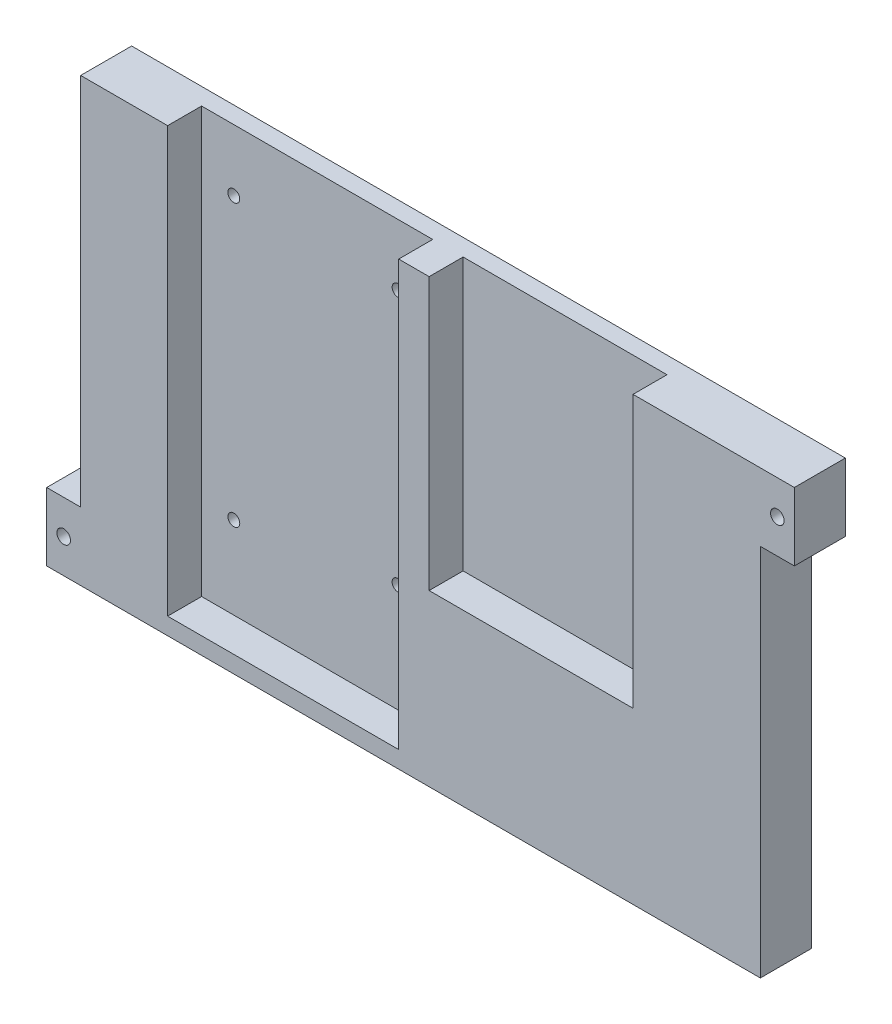
ISO-10303-21;
HEADER;
FILE_DESCRIPTION(('STEP AP214'),'2;1');
FILE_NAME('part.step','',(''),(''),'','','');
FILE_SCHEMA(('AUTOMOTIVE_DESIGN { 1 0 10303 214 1 1 1 1 }'));
ENDSEC;
DATA;
#1=APPLICATION_CONTEXT('core data for automotive mechanical design processes');
#2=APPLICATION_PROTOCOL_DEFINITION('international standard','automotive_design',2000,#1);
#3=PRODUCT_CONTEXT('',#1,'mechanical');
#4=PRODUCT('Part','Part','',(#3));
#5=PRODUCT_RELATED_PRODUCT_CATEGORY('part','',(#4));
#6=PRODUCT_DEFINITION_FORMATION('','',#4);
#7=PRODUCT_DEFINITION_CONTEXT('part definition',#1,'design');
#8=PRODUCT_DEFINITION('design','',#6,#7);
#9=PRODUCT_DEFINITION_SHAPE('','',#8);
#10=(LENGTH_UNIT() NAMED_UNIT(*) SI_UNIT(.MILLI.,.METRE.));
#11=(NAMED_UNIT(*) PLANE_ANGLE_UNIT() SI_UNIT($,.RADIAN.));
#12=(NAMED_UNIT(*) SI_UNIT($,.STERADIAN.) SOLID_ANGLE_UNIT());
#13=UNCERTAINTY_MEASURE_WITH_UNIT(LENGTH_MEASURE(1.E-05),#10,'distance_accuracy_value','');
#14=(GEOMETRIC_REPRESENTATION_CONTEXT(3) GLOBAL_UNCERTAINTY_ASSIGNED_CONTEXT((#13)) GLOBAL_UNIT_ASSIGNED_CONTEXT((#10,
#11,#12)) REPRESENTATION_CONTEXT('',''));
#15=CARTESIAN_POINT('',(0.,0.,0.));
#16=DIRECTION('',(0.,0.,1.));
#17=DIRECTION('',(1.,0.,0.));
#18=AXIS2_PLACEMENT_3D('',#15,#16,#17);
#19=CARTESIAN_POINT('',(0.,130.,15.));
#20=DIRECTION('',(0.,1.,0.));
#21=DIRECTION('',(-1.,0.,0.));
#22=AXIS2_PLACEMENT_3D('',#19,#20,#21);
#23=PLANE('',#22);
#24=DIRECTION('',(0.,0.,1.));
#25=VECTOR('',#24,1.);
#26=CARTESIAN_POINT('',(25.5840381624613,130.,5.));
#27=LINE('',#26,#25);
#28=CARTESIAN_POINT('',(25.5840381624613,130.,5.));
#29=VERTEX_POINT('',#28);
#30=CARTESIAN_POINT('',(25.5840381624613,130.,15.));
#31=VERTEX_POINT('',#30);
#32=EDGE_CURVE('E214',#29,#31,#27,.T.);
#33=ORIENTED_EDGE('',*,*,#32,.F.);
#34=DIRECTION('',(-1.,0.,0.));
#35=VECTOR('',#34,1.);
#36=CARTESIAN_POINT('',(25.5840381624613,130.,5.));
#37=LINE('',#36,#35);
#38=CARTESIAN_POINT('',(93.5840381624613,130.,5.));
#39=VERTEX_POINT('',#38);
#40=EDGE_CURVE('E253',#39,#29,#37,.T.);
#41=ORIENTED_EDGE('',*,*,#40,.F.);
#42=DIRECTION('',(0.,0.,1.));
#43=VECTOR('',#42,1.);
#44=CARTESIAN_POINT('',(93.5840381624613,130.,5.));
#45=LINE('',#44,#43);
#46=CARTESIAN_POINT('',(93.5840381624613,130.,15.));
#47=VERTEX_POINT('',#46);
#48=EDGE_CURVE('E314',#39,#47,#45,.T.);
#49=ORIENTED_EDGE('',*,*,#48,.T.);
#50=DIRECTION('',(1.,0.,0.));
#51=VECTOR('',#50,1.);
#52=CARTESIAN_POINT('',(0.,130.,15.));
#53=LINE('',#52,#51);
#54=CARTESIAN_POINT('',(102.534942581207,130.,15.));
#55=VERTEX_POINT('',#54);
#56=EDGE_CURVE('E273',#47,#55,#53,.T.);
#57=ORIENTED_EDGE('',*,*,#56,.T.);
#58=DIRECTION('',(0.,0.,1.));
#59=VECTOR('',#58,1.);
#60=CARTESIAN_POINT('',(102.534942581207,130.,5.));
#61=LINE('',#60,#59);
#62=CARTESIAN_POINT('',(102.534942581207,130.,5.));
#63=VERTEX_POINT('',#62);
#64=EDGE_CURVE('E291',#63,#55,#61,.T.);
#65=ORIENTED_EDGE('',*,*,#64,.F.);
#66=DIRECTION('',(-1.,0.,0.));
#67=VECTOR('',#66,1.);
#68=CARTESIAN_POINT('',(102.534942581207,130.,5.));
#69=LINE('',#68,#67);
#70=CARTESIAN_POINT('',(162.534942581207,130.,5.));
#71=VERTEX_POINT('',#70);
#72=EDGE_CURVE('E301',#71,#63,#69,.T.);
#73=ORIENTED_EDGE('',*,*,#72,.F.);
#74=DIRECTION('',(0.,0.,1.));
#75=VECTOR('',#74,1.);
#76=CARTESIAN_POINT('',(162.534942581207,130.,5.));
#77=LINE('',#76,#75);
#78=CARTESIAN_POINT('',(162.534942581207,130.,15.));
#79=VERTEX_POINT('',#78);
#80=EDGE_CURVE('E326',#71,#79,#77,.T.);
#81=ORIENTED_EDGE('',*,*,#80,.T.);
#82=CARTESIAN_POINT('',(210.,130.,15.));
#83=VERTEX_POINT('',#82);
#84=EDGE_CURVE('E217',#79,#83,#53,.T.);
#85=ORIENTED_EDGE('',*,*,#84,.T.);
#86=DIRECTION('',(0.,0.,1.));
#87=VECTOR('',#86,1.);
#88=CARTESIAN_POINT('',(210.,130.,15.));
#89=LINE('',#88,#87);
#90=CARTESIAN_POINT('',(210.,130.,0.));
#91=VERTEX_POINT('',#90);
#92=EDGE_CURVE('E408',#91,#83,#89,.T.);
#93=ORIENTED_EDGE('',*,*,#92,.F.);
#94=DIRECTION('',(1.,0.,0.));
#95=VECTOR('',#94,1.);
#96=CARTESIAN_POINT('',(0.,130.,0.));
#97=LINE('',#96,#95);
#98=CARTESIAN_POINT('',(0.,130.,0.));
#99=VERTEX_POINT('',#98);
#100=EDGE_CURVE('E212',#99,#91,#97,.T.);
#101=ORIENTED_EDGE('',*,*,#100,.F.);
#102=DIRECTION('',(0.,0.,-1.));
#103=VECTOR('',#102,1.);
#104=CARTESIAN_POINT('',(0.,130.,15.));
#105=LINE('',#104,#103);
#106=CARTESIAN_POINT('',(0.,130.,15.));
#107=VERTEX_POINT('',#106);
#108=EDGE_CURVE('E12',#107,#99,#105,.T.);
#109=ORIENTED_EDGE('',*,*,#108,.F.);
#110=EDGE_CURVE('E269',#107,#31,#53,.T.);
#111=ORIENTED_EDGE('',*,*,#110,.T.);
#112=EDGE_LOOP('',(#33,#41,#49,#57,#65,#73,#81,#85,#93,#101,#109,#111));
#113=FACE_BOUND('',#112,.T.);
#114=ADVANCED_FACE('F44',(#113),#23,.T.);
#115=CARTESIAN_POINT('',(0.,0.,15.));
#116=DIRECTION('',(-1.,0.,0.));
#117=DIRECTION('',(0.,-1.,0.));
#118=AXIS2_PLACEMENT_3D('',#115,#116,#117);
#119=PLANE('',#118);
#120=DIRECTION('',(0.,0.,-1.));
#121=VECTOR('',#120,1.);
#122=CARTESIAN_POINT('',(0.,20.,0.));
#123=LINE('',#122,#121);
#124=CARTESIAN_POINT('',(0.,20.,15.));
#125=VERTEX_POINT('',#124);
#126=CARTESIAN_POINT('',(0.,20.,0.));
#127=VERTEX_POINT('',#126);
#128=EDGE_CURVE('E60',#125,#127,#123,.T.);
#129=ORIENTED_EDGE('',*,*,#128,.F.);
#130=DIRECTION('',(0.,1.,0.));
#131=VECTOR('',#130,1.);
#132=CARTESIAN_POINT('',(0.,0.,15.));
#133=LINE('',#132,#131);
#134=EDGE_CURVE('E206',#125,#107,#133,.T.);
#135=ORIENTED_EDGE('',*,*,#134,.T.);
#136=ORIENTED_EDGE('',*,*,#108,.T.);
#137=DIRECTION('',(0.,1.,0.));
#138=VECTOR('',#137,1.);
#139=CARTESIAN_POINT('',(0.,0.,0.));
#140=LINE('',#139,#138);
#141=EDGE_CURVE('E169',#127,#99,#140,.T.);
#142=ORIENTED_EDGE('',*,*,#141,.F.);
#143=EDGE_LOOP('',(#129,#135,#136,#142));
#144=FACE_BOUND('',#143,.T.);
#145=ADVANCED_FACE('F375',(#144),#119,.T.);
#146=CARTESIAN_POINT('',(0.,0.,15.));
#147=DIRECTION('',(0.,1.,0.));
#148=DIRECTION('',(-1.,0.,0.));
#149=AXIS2_PLACEMENT_3D('',#146,#147,#148);
#150=PLANE('',#149);
#151=DIRECTION('',(1.,0.,0.));
#152=VECTOR('',#151,1.);
#153=CARTESIAN_POINT('',(0.,0.,0.));
#154=LINE('',#153,#152);
#155=CARTESIAN_POINT('',(-10.,0.,0.));
#156=VERTEX_POINT('',#155);
#157=CARTESIAN_POINT('',(200.,0.,0.));
#158=VERTEX_POINT('',#157);
#159=EDGE_CURVE('E158',#156,#158,#154,.T.);
#160=ORIENTED_EDGE('',*,*,#159,.T.);
#161=DIRECTION('',(0.,0.,-1.));
#162=VECTOR('',#161,1.);
#163=CARTESIAN_POINT('',(200.,0.,15.));
#164=LINE('',#163,#162);
#165=CARTESIAN_POINT('',(200.,0.,15.));
#166=VERTEX_POINT('',#165);
#167=EDGE_CURVE('E52',#166,#158,#164,.T.);
#168=ORIENTED_EDGE('',*,*,#167,.F.);
#169=DIRECTION('',(1.,0.,0.));
#170=VECTOR('',#169,1.);
#171=CARTESIAN_POINT('',(0.,0.,15.));
#172=LINE('',#171,#170);
#173=CARTESIAN_POINT('',(-10.,0.,15.));
#174=VERTEX_POINT('',#173);
#175=EDGE_CURVE('E175',#174,#166,#172,.T.);
#176=ORIENTED_EDGE('',*,*,#175,.F.);
#177=DIRECTION('',(0.,0.,1.));
#178=VECTOR('',#177,1.);
#179=CARTESIAN_POINT('',(-10.,0.,0.));
#180=LINE('',#179,#178);
#181=EDGE_CURVE('E172',#156,#174,#180,.T.);
#182=ORIENTED_EDGE('',*,*,#181,.F.);
#183=EDGE_LOOP('',(#160,#168,#176,#182));
#184=FACE_BOUND('',#183,.T.);
#185=ADVANCED_FACE('F173',(#184),#150,.F.);
#186=CARTESIAN_POINT('',(200.,0.,15.));
#187=DIRECTION('',(1.,0.,0.));
#188=DIRECTION('',(0.,1.,0.));
#189=AXIS2_PLACEMENT_3D('',#186,#187,#188);
#190=PLANE('',#189);
#191=DIRECTION('',(0.,0.,-1.));
#192=VECTOR('',#191,1.);
#193=CARTESIAN_POINT('',(200.,110.,15.));
#194=LINE('',#193,#192);
#195=CARTESIAN_POINT('',(200.,110.,15.));
#196=VERTEX_POINT('',#195);
#197=CARTESIAN_POINT('',(200.,110.,0.));
#198=VERTEX_POINT('',#197);
#199=EDGE_CURVE('E68',#196,#198,#194,.T.);
#200=ORIENTED_EDGE('',*,*,#199,.F.);
#201=DIRECTION('',(0.,-1.,0.));
#202=VECTOR('',#201,1.);
#203=CARTESIAN_POINT('',(200.,0.,15.));
#204=LINE('',#203,#202);
#205=EDGE_CURVE('E205',#196,#166,#204,.T.);
#206=ORIENTED_EDGE('',*,*,#205,.T.);
#207=ORIENTED_EDGE('',*,*,#167,.T.);
#208=DIRECTION('',(0.,-1.,0.));
#209=VECTOR('',#208,1.);
#210=CARTESIAN_POINT('',(200.,0.,0.));
#211=LINE('',#210,#209);
#212=EDGE_CURVE('E165',#198,#158,#211,.T.);
#213=ORIENTED_EDGE('',*,*,#212,.F.);
#214=EDGE_LOOP('',(#200,#206,#207,#213));
#215=FACE_BOUND('',#214,.T.);
#216=ADVANCED_FACE('F493',(#215),#190,.T.);
#217=CARTESIAN_POINT('',(0.,0.,15.));
#218=DIRECTION('',(0.,0.,1.));
#219=DIRECTION('',(1.,0.,0.));
#220=AXIS2_PLACEMENT_3D('',#217,#218,#219);
#221=PLANE('',#220);
#222=CARTESIAN_POINT('',(-5.,10.,15.));
#223=DIRECTION('',(0.,0.,1.));
#224=DIRECTION('',(1.,0.,0.));
#225=AXIS2_PLACEMENT_3D('',#222,#223,#224);
#226=CIRCLE('',#225,2.);
#227=CARTESIAN_POINT('',(-3.,10.,15.));
#228=VERTEX_POINT('',#227);
#229=EDGE_CURVE('E185',#228,#228,#226,.F.);
#230=ORIENTED_EDGE('',*,*,#229,.T.);
#231=EDGE_LOOP('',(#230));
#232=FACE_BOUND('',#231,.T.);
#233=CARTESIAN_POINT('',(205.,120.,15.));
#234=DIRECTION('',(0.,0.,1.));
#235=DIRECTION('',(1.,0.,0.));
#236=AXIS2_PLACEMENT_3D('',#233,#234,#235);
#237=CIRCLE('',#236,2.);
#238=CARTESIAN_POINT('',(207.,120.,15.));
#239=VERTEX_POINT('',#238);
#240=EDGE_CURVE('E348',#239,#239,#237,.F.);
#241=ORIENTED_EDGE('',*,*,#240,.T.);
#242=EDGE_LOOP('',(#241));
#243=FACE_BOUND('',#242,.T.);
#244=DIRECTION('',(0.,-1.,0.));
#245=VECTOR('',#244,1.);
#246=CARTESIAN_POINT('',(25.5840381624613,130.,15.));
#247=LINE('',#246,#245);
#248=CARTESIAN_POINT('',(25.5840381624613,5.,15.));
#249=VERTEX_POINT('',#248);
#250=EDGE_CURVE('E300',#31,#249,#247,.T.);
#251=ORIENTED_EDGE('',*,*,#250,.F.);
#252=ORIENTED_EDGE('',*,*,#110,.F.);
#253=ORIENTED_EDGE('',*,*,#134,.F.);
#254=DIRECTION('',(1.,0.,0.));
#255=VECTOR('',#254,1.);
#256=CARTESIAN_POINT('',(-10.,20.,15.));
#257=LINE('',#256,#255);
#258=CARTESIAN_POINT('',(-10.,20.,15.));
#259=VERTEX_POINT('',#258);
#260=EDGE_CURVE('E426',#259,#125,#257,.T.);
#261=ORIENTED_EDGE('',*,*,#260,.F.);
#262=DIRECTION('',(0.,1.,0.));
#263=VECTOR('',#262,1.);
#264=CARTESIAN_POINT('',(-10.,20.,15.));
#265=LINE('',#264,#263);
#266=EDGE_CURVE('E178',#174,#259,#265,.T.);
#267=ORIENTED_EDGE('',*,*,#266,.F.);
#268=ORIENTED_EDGE('',*,*,#175,.T.);
#269=ORIENTED_EDGE('',*,*,#205,.F.);
#270=DIRECTION('',(-1.,0.,0.));
#271=VECTOR('',#270,1.);
#272=CARTESIAN_POINT('',(210.,110.,15.));
#273=LINE('',#272,#271);
#274=CARTESIAN_POINT('',(210.,110.,15.));
#275=VERTEX_POINT('',#274);
#276=EDGE_CURVE('E422',#275,#196,#273,.T.);
#277=ORIENTED_EDGE('',*,*,#276,.F.);
#278=DIRECTION('',(0.,-1.,0.));
#279=VECTOR('',#278,1.);
#280=CARTESIAN_POINT('',(210.,130.,15.));
#281=LINE('',#280,#279);
#282=EDGE_CURVE('E415',#83,#275,#281,.T.);
#283=ORIENTED_EDGE('',*,*,#282,.F.);
#284=ORIENTED_EDGE('',*,*,#84,.F.);
#285=DIRECTION('',(0.,1.,0.));
#286=VECTOR('',#285,1.);
#287=CARTESIAN_POINT('',(162.534942581207,130.,15.));
#288=LINE('',#287,#286);
#289=CARTESIAN_POINT('',(162.534942581207,50.,15.));
#290=VERTEX_POINT('',#289);
#291=EDGE_CURVE('E265',#290,#79,#288,.T.);
#292=ORIENTED_EDGE('',*,*,#291,.F.);
#293=DIRECTION('',(1.,0.,0.));
#294=VECTOR('',#293,1.);
#295=CARTESIAN_POINT('',(102.534942581207,50.,15.));
#296=LINE('',#295,#294);
#297=CARTESIAN_POINT('',(102.534942581207,50.,15.));
#298=VERTEX_POINT('',#297);
#299=EDGE_CURVE('E290',#298,#290,#296,.T.);
#300=ORIENTED_EDGE('',*,*,#299,.F.);
#301=DIRECTION('',(0.,-1.,0.));
#302=VECTOR('',#301,1.);
#303=CARTESIAN_POINT('',(102.534942581207,130.,15.));
#304=LINE('',#303,#302);
#305=EDGE_CURVE('E297',#55,#298,#304,.T.);
#306=ORIENTED_EDGE('',*,*,#305,.F.);
#307=ORIENTED_EDGE('',*,*,#56,.F.);
#308=DIRECTION('',(0.,1.,0.));
#309=VECTOR('',#308,1.);
#310=CARTESIAN_POINT('',(93.5840381624613,130.,15.));
#311=LINE('',#310,#309);
#312=CARTESIAN_POINT('',(93.5840381624613,5.,15.));
#313=VERTEX_POINT('',#312);
#314=EDGE_CURVE('E242',#313,#47,#311,.T.);
#315=ORIENTED_EDGE('',*,*,#314,.F.);
#316=DIRECTION('',(1.,0.,0.));
#317=VECTOR('',#316,1.);
#318=CARTESIAN_POINT('',(25.5840381624613,5.,15.));
#319=LINE('',#318,#317);
#320=EDGE_CURVE('E311',#249,#313,#319,.T.);
#321=ORIENTED_EDGE('',*,*,#320,.F.);
#322=EDGE_LOOP('',(#251,#252,#253,#261,#267,#268,#269,#277,#283,#284,#292,#300,#306,#307,#315,#321));
#323=FACE_BOUND('',#322,.T.);
#324=ADVANCED_FACE('F363',(#232,#243,#323),#221,.T.);
#325=CARTESIAN_POINT('',(0.,0.,0.));
#326=DIRECTION('',(0.,0.,1.));
#327=DIRECTION('',(1.,0.,0.));
#328=AXIS2_PLACEMENT_3D('',#325,#326,#327);
#329=PLANE('',#328);
#330=CARTESIAN_POINT('',(-5.,10.,0.));
#331=DIRECTION('',(0.,0.,1.));
#332=DIRECTION('',(1.,0.,0.));
#333=AXIS2_PLACEMENT_3D('',#330,#331,#332);
#334=CIRCLE('',#333,2.);
#335=CARTESIAN_POINT('',(-3.,10.,0.));
#336=VERTEX_POINT('',#335);
#337=EDGE_CURVE('E47',#336,#336,#334,.F.);
#338=ORIENTED_EDGE('',*,*,#337,.F.);
#339=EDGE_LOOP('',(#338));
#340=FACE_BOUND('',#339,.T.);
#341=CARTESIAN_POINT('',(205.,120.,0.));
#342=DIRECTION('',(0.,0.,1.));
#343=DIRECTION('',(1.,0.,0.));
#344=AXIS2_PLACEMENT_3D('',#341,#342,#343);
#345=CIRCLE('',#344,2.);
#346=CARTESIAN_POINT('',(207.,120.,0.));
#347=VERTEX_POINT('',#346);
#348=EDGE_CURVE('E346',#347,#347,#345,.F.);
#349=ORIENTED_EDGE('',*,*,#348,.F.);
#350=EDGE_LOOP('',(#349));
#351=FACE_BOUND('',#350,.T.);
#352=CARTESIAN_POINT('',(35.0630992116401,29.2684176833599,0.));
#353=DIRECTION('',(0.,0.,1.));
#354=DIRECTION('',(1.,0.,0.));
#355=AXIS2_PLACEMENT_3D('',#352,#353,#354);
#356=CIRCLE('',#355,1.75);
#357=CARTESIAN_POINT('',(36.8130992116401,29.2684176833599,0.));
#358=VERTEX_POINT('',#357);
#359=EDGE_CURVE('E436',#358,#358,#356,.T.);
#360=ORIENTED_EDGE('',*,*,#359,.T.);
#361=EDGE_LOOP('',(#360));
#362=FACE_BOUND('',#361,.T.);
#363=CARTESIAN_POINT('',(83.3992992116401,36.7614176833599,0.));
#364=DIRECTION('',(0.,0.,1.));
#365=DIRECTION('',(1.,0.,0.));
#366=AXIS2_PLACEMENT_3D('',#363,#364,#365);
#367=CIRCLE('',#366,1.75000000000003);
#368=CARTESIAN_POINT('',(85.1492992116401,36.7614176833599,0.));
#369=VERTEX_POINT('',#368);
#370=EDGE_CURVE('E440',#369,#369,#367,.T.);
#371=ORIENTED_EDGE('',*,*,#370,.T.);
#372=EDGE_LOOP('',(#371));
#373=FACE_BOUND('',#372,.T.);
#374=CARTESIAN_POINT('',(83.3992992116401,111.89461768336,0.));
#375=DIRECTION('',(0.,0.,1.));
#376=DIRECTION('',(1.,0.,0.));
#377=AXIS2_PLACEMENT_3D('',#374,#375,#376);
#378=CIRCLE('',#377,1.75000000000001);
#379=CARTESIAN_POINT('',(85.1492992116401,111.89461768336,0.));
#380=VERTEX_POINT('',#379);
#381=EDGE_CURVE('E437',#380,#380,#378,.T.);
#382=ORIENTED_EDGE('',*,*,#381,.T.);
#383=EDGE_LOOP('',(#382));
#384=FACE_BOUND('',#383,.T.);
#385=CARTESIAN_POINT('',(35.0630992116401,111.89461768336,0.));
#386=DIRECTION('',(0.,0.,1.));
#387=DIRECTION('',(1.,0.,0.));
#388=AXIS2_PLACEMENT_3D('',#385,#386,#387);
#389=CIRCLE('',#388,1.75);
#390=CARTESIAN_POINT('',(36.8130992116401,111.89461768336,0.));
#391=VERTEX_POINT('',#390);
#392=EDGE_CURVE('E225',#391,#391,#389,.T.);
#393=ORIENTED_EDGE('',*,*,#392,.T.);
#394=EDGE_LOOP('',(#393));
#395=FACE_BOUND('',#394,.T.);
#396=ORIENTED_EDGE('',*,*,#100,.T.);
#397=DIRECTION('',(0.,1.,0.));
#398=VECTOR('',#397,1.);
#399=CARTESIAN_POINT('',(210.,130.,0.));
#400=LINE('',#399,#398);
#401=CARTESIAN_POINT('',(210.,110.,0.));
#402=VERTEX_POINT('',#401);
#403=EDGE_CURVE('E418',#402,#91,#400,.T.);
#404=ORIENTED_EDGE('',*,*,#403,.F.);
#405=DIRECTION('',(-1.,0.,0.));
#406=VECTOR('',#405,1.);
#407=CARTESIAN_POINT('',(210.,110.,0.));
#408=LINE('',#407,#406);
#409=EDGE_CURVE('E419',#402,#198,#408,.T.);
#410=ORIENTED_EDGE('',*,*,#409,.T.);
#411=ORIENTED_EDGE('',*,*,#212,.T.);
#412=ORIENTED_EDGE('',*,*,#159,.F.);
#413=DIRECTION('',(0.,-1.,0.));
#414=VECTOR('',#413,1.);
#415=CARTESIAN_POINT('',(-10.,20.,0.));
#416=LINE('',#415,#414);
#417=CARTESIAN_POINT('',(-10.,20.,0.));
#418=VERTEX_POINT('',#417);
#419=EDGE_CURVE('E163',#418,#156,#416,.T.);
#420=ORIENTED_EDGE('',*,*,#419,.F.);
#421=DIRECTION('',(1.,0.,0.));
#422=VECTOR('',#421,1.);
#423=CARTESIAN_POINT('',(-10.,20.,0.));
#424=LINE('',#423,#422);
#425=EDGE_CURVE('E746',#418,#127,#424,.T.);
#426=ORIENTED_EDGE('',*,*,#425,.T.);
#427=ORIENTED_EDGE('',*,*,#141,.T.);
#428=EDGE_LOOP('',(#396,#404,#410,#411,#412,#420,#426,#427));
#429=FACE_BOUND('',#428,.T.);
#430=ADVANCED_FACE('F160',(#340,#351,#362,#373,#384,#395,#429),#329,.F.);
#431=CARTESIAN_POINT('',(102.534942581207,130.,5.));
#432=DIRECTION('',(-1.,0.,0.));
#433=DIRECTION('',(0.,0.,1.));
#434=AXIS2_PLACEMENT_3D('',#431,#432,#433);
#435=PLANE('',#434);
#436=ORIENTED_EDGE('',*,*,#305,.T.);
#437=DIRECTION('',(0.,0.,1.));
#438=VECTOR('',#437,1.);
#439=CARTESIAN_POINT('',(102.534942581207,50.,5.));
#440=LINE('',#439,#438);
#441=CARTESIAN_POINT('',(102.534942581207,50.,5.));
#442=VERTEX_POINT('',#441);
#443=EDGE_CURVE('E322',#442,#298,#440,.T.);
#444=ORIENTED_EDGE('',*,*,#443,.F.);
#445=DIRECTION('',(0.,-1.,0.));
#446=VECTOR('',#445,1.);
#447=CARTESIAN_POINT('',(102.534942581207,130.,5.));
#448=LINE('',#447,#446);
#449=EDGE_CURVE('E261',#63,#442,#448,.T.);
#450=ORIENTED_EDGE('',*,*,#449,.F.);
#451=ORIENTED_EDGE('',*,*,#64,.T.);
#452=EDGE_LOOP('',(#436,#444,#450,#451));
#453=FACE_BOUND('',#452,.T.);
#454=ADVANCED_FACE('F477',(#453),#435,.F.);
#455=CARTESIAN_POINT('',(162.534942581207,130.,5.));
#456=DIRECTION('',(1.,0.,0.));
#457=DIRECTION('',(0.,0.,-1.));
#458=AXIS2_PLACEMENT_3D('',#455,#456,#457);
#459=PLANE('',#458);
#460=ORIENTED_EDGE('',*,*,#291,.T.);
#461=ORIENTED_EDGE('',*,*,#80,.F.);
#462=DIRECTION('',(0.,1.,0.));
#463=VECTOR('',#462,1.);
#464=CARTESIAN_POINT('',(162.534942581207,130.,5.));
#465=LINE('',#464,#463);
#466=CARTESIAN_POINT('',(162.534942581207,50.,5.));
#467=VERTEX_POINT('',#466);
#468=EDGE_CURVE('E734',#467,#71,#465,.T.);
#469=ORIENTED_EDGE('',*,*,#468,.F.);
#470=DIRECTION('',(0.,0.,1.));
#471=VECTOR('',#470,1.);
#472=CARTESIAN_POINT('',(162.534942581207,50.,5.));
#473=LINE('',#472,#471);
#474=EDGE_CURVE('E325',#467,#290,#473,.T.);
#475=ORIENTED_EDGE('',*,*,#474,.T.);
#476=EDGE_LOOP('',(#460,#461,#469,#475));
#477=FACE_BOUND('',#476,.T.);
#478=ADVANCED_FACE('F480',(#477),#459,.F.);
#479=CARTESIAN_POINT('',(102.534942581207,50.,5.));
#480=DIRECTION('',(0.,-1.,0.));
#481=DIRECTION('',(0.,0.,-1.));
#482=AXIS2_PLACEMENT_3D('',#479,#480,#481);
#483=PLANE('',#482);
#484=ORIENTED_EDGE('',*,*,#299,.T.);
#485=ORIENTED_EDGE('',*,*,#474,.F.);
#486=DIRECTION('',(1.,0.,0.));
#487=VECTOR('',#486,1.);
#488=CARTESIAN_POINT('',(102.534942581207,50.,5.));
#489=LINE('',#488,#487);
#490=EDGE_CURVE('E266',#442,#467,#489,.T.);
#491=ORIENTED_EDGE('',*,*,#490,.F.);
#492=ORIENTED_EDGE('',*,*,#443,.T.);
#493=EDGE_LOOP('',(#484,#485,#491,#492));
#494=FACE_BOUND('',#493,.T.);
#495=ADVANCED_FACE('F481',(#494),#483,.F.);
#496=CARTESIAN_POINT('',(0.,0.,5.));
#497=DIRECTION('',(0.,0.,1.));
#498=DIRECTION('',(1.,0.,0.));
#499=AXIS2_PLACEMENT_3D('',#496,#497,#498);
#500=PLANE('',#499);
#501=ORIENTED_EDGE('',*,*,#449,.T.);
#502=ORIENTED_EDGE('',*,*,#490,.T.);
#503=ORIENTED_EDGE('',*,*,#468,.T.);
#504=ORIENTED_EDGE('',*,*,#72,.T.);
#505=EDGE_LOOP('',(#501,#502,#503,#504));
#506=FACE_BOUND('',#505,.T.);
#507=ADVANCED_FACE('F476',(#506),#500,.T.);
#508=CARTESIAN_POINT('',(25.5840381624613,130.,5.));
#509=DIRECTION('',(-1.,0.,0.));
#510=DIRECTION('',(0.,-1.,0.));
#511=AXIS2_PLACEMENT_3D('',#508,#509,#510);
#512=PLANE('',#511);
#513=ORIENTED_EDGE('',*,*,#250,.T.);
#514=DIRECTION('',(0.,0.,1.));
#515=VECTOR('',#514,1.);
#516=CARTESIAN_POINT('',(25.5840381624613,5.,5.));
#517=LINE('',#516,#515);
#518=CARTESIAN_POINT('',(25.5840381624613,5.,5.));
#519=VERTEX_POINT('',#518);
#520=EDGE_CURVE('E319',#519,#249,#517,.T.);
#521=ORIENTED_EDGE('',*,*,#520,.F.);
#522=DIRECTION('',(0.,-1.,0.));
#523=VECTOR('',#522,1.);
#524=CARTESIAN_POINT('',(25.5840381624613,130.,5.));
#525=LINE('',#524,#523);
#526=EDGE_CURVE('E236',#29,#519,#525,.T.);
#527=ORIENTED_EDGE('',*,*,#526,.F.);
#528=ORIENTED_EDGE('',*,*,#32,.T.);
#529=EDGE_LOOP('',(#513,#521,#527,#528));
#530=FACE_BOUND('',#529,.T.);
#531=ADVANCED_FACE('F388',(#530),#512,.F.);
#532=CARTESIAN_POINT('',(93.5840381624613,130.,5.));
#533=DIRECTION('',(1.,0.,0.));
#534=DIRECTION('',(0.,1.,0.));
#535=AXIS2_PLACEMENT_3D('',#532,#533,#534);
#536=PLANE('',#535);
#537=ORIENTED_EDGE('',*,*,#314,.T.);
#538=ORIENTED_EDGE('',*,*,#48,.F.);
#539=DIRECTION('',(0.,1.,0.));
#540=VECTOR('',#539,1.);
#541=CARTESIAN_POINT('',(93.5840381624613,130.,5.));
#542=LINE('',#541,#540);
#543=CARTESIAN_POINT('',(93.5840381624613,5.,5.));
#544=VERTEX_POINT('',#543);
#545=EDGE_CURVE('E248',#544,#39,#542,.T.);
#546=ORIENTED_EDGE('',*,*,#545,.F.);
#547=DIRECTION('',(0.,0.,1.));
#548=VECTOR('',#547,1.);
#549=CARTESIAN_POINT('',(93.5840381624613,5.,5.));
#550=LINE('',#549,#548);
#551=EDGE_CURVE('E317',#544,#313,#550,.T.);
#552=ORIENTED_EDGE('',*,*,#551,.T.);
#553=EDGE_LOOP('',(#537,#538,#546,#552));
#554=FACE_BOUND('',#553,.T.);
#555=ADVANCED_FACE('F401',(#554),#536,.F.);
#556=CARTESIAN_POINT('',(25.5840381624613,5.,5.));
#557=DIRECTION('',(0.,-1.,0.));
#558=DIRECTION('',(0.,0.,-1.));
#559=AXIS2_PLACEMENT_3D('',#556,#557,#558);
#560=PLANE('',#559);
#561=ORIENTED_EDGE('',*,*,#320,.T.);
#562=ORIENTED_EDGE('',*,*,#551,.F.);
#563=DIRECTION('',(1.,0.,0.));
#564=VECTOR('',#563,1.);
#565=CARTESIAN_POINT('',(25.5840381624613,5.,5.));
#566=LINE('',#565,#564);
#567=EDGE_CURVE('E241',#519,#544,#566,.T.);
#568=ORIENTED_EDGE('',*,*,#567,.F.);
#569=ORIENTED_EDGE('',*,*,#520,.T.);
#570=EDGE_LOOP('',(#561,#562,#568,#569));
#571=FACE_BOUND('',#570,.T.);
#572=ADVANCED_FACE('F395',(#571),#560,.F.);
#573=CARTESIAN_POINT('',(0.,0.,5.));
#574=DIRECTION('',(0.,0.,1.));
#575=DIRECTION('',(1.,0.,0.));
#576=AXIS2_PLACEMENT_3D('',#573,#574,#575);
#577=PLANE('',#576);
#578=CARTESIAN_POINT('',(35.0630992116401,29.2684176833599,5.));
#579=DIRECTION('',(0.,0.,1.));
#580=DIRECTION('',(1.,0.,0.));
#581=AXIS2_PLACEMENT_3D('',#578,#579,#580);
#582=CIRCLE('',#581,1.75);
#583=CARTESIAN_POINT('',(36.8130992116401,29.2684176833599,5.));
#584=VERTEX_POINT('',#583);
#585=EDGE_CURVE('E331',#584,#584,#582,.T.);
#586=ORIENTED_EDGE('',*,*,#585,.F.);
#587=EDGE_LOOP('',(#586));
#588=FACE_BOUND('',#587,.T.);
#589=CARTESIAN_POINT('',(83.3992992116401,36.7614176833599,5.));
#590=DIRECTION('',(0.,0.,1.));
#591=DIRECTION('',(1.,0.,0.));
#592=AXIS2_PLACEMENT_3D('',#589,#590,#591);
#593=CIRCLE('',#592,1.75000000000003);
#594=CARTESIAN_POINT('',(85.1492992116401,36.7614176833599,5.));
#595=VERTEX_POINT('',#594);
#596=EDGE_CURVE('E337',#595,#595,#593,.T.);
#597=ORIENTED_EDGE('',*,*,#596,.F.);
#598=EDGE_LOOP('',(#597));
#599=FACE_BOUND('',#598,.T.);
#600=CARTESIAN_POINT('',(83.3992992116401,111.89461768336,5.));
#601=DIRECTION('',(0.,0.,1.));
#602=DIRECTION('',(1.,0.,0.));
#603=AXIS2_PLACEMENT_3D('',#600,#601,#602);
#604=CIRCLE('',#603,1.75000000000001);
#605=CARTESIAN_POINT('',(85.1492992116401,111.89461768336,5.));
#606=VERTEX_POINT('',#605);
#607=EDGE_CURVE('E224',#606,#606,#604,.T.);
#608=ORIENTED_EDGE('',*,*,#607,.F.);
#609=EDGE_LOOP('',(#608));
#610=FACE_BOUND('',#609,.T.);
#611=CARTESIAN_POINT('',(35.0630992116401,111.89461768336,5.));
#612=DIRECTION('',(0.,0.,1.));
#613=DIRECTION('',(1.,0.,0.));
#614=AXIS2_PLACEMENT_3D('',#611,#612,#613);
#615=CIRCLE('',#614,1.75);
#616=CARTESIAN_POINT('',(36.8130992116401,111.89461768336,5.));
#617=VERTEX_POINT('',#616);
#618=EDGE_CURVE('E219',#617,#617,#615,.T.);
#619=ORIENTED_EDGE('',*,*,#618,.F.);
#620=EDGE_LOOP('',(#619));
#621=FACE_BOUND('',#620,.T.);
#622=ORIENTED_EDGE('',*,*,#526,.T.);
#623=ORIENTED_EDGE('',*,*,#567,.T.);
#624=ORIENTED_EDGE('',*,*,#545,.T.);
#625=ORIENTED_EDGE('',*,*,#40,.T.);
#626=EDGE_LOOP('',(#622,#623,#624,#625));
#627=FACE_BOUND('',#626,.T.);
#628=ADVANCED_FACE('F465',(#588,#599,#610,#621,#627),#577,.T.);
#629=CARTESIAN_POINT('',(35.0630992116401,111.89461768336,0.));
#630=DIRECTION('',(0.,0.,1.));
#631=DIRECTION('',(1.,0.,0.));
#632=AXIS2_PLACEMENT_3D('',#629,#630,#631);
#633=CYLINDRICAL_SURFACE('',#632,1.75);
#634=ORIENTED_EDGE('',*,*,#618,.T.);
#635=EDGE_LOOP('',(#634));
#636=FACE_BOUND('',#635,.T.);
#637=ORIENTED_EDGE('',*,*,#392,.F.);
#638=EDGE_LOOP('',(#637));
#639=FACE_BOUND('',#638,.T.);
#640=ADVANCED_FACE('F462',(#636,#639),#633,.F.);
#641=CARTESIAN_POINT('',(83.3992992116401,111.89461768336,0.));
#642=DIRECTION('',(0.,0.,1.));
#643=DIRECTION('',(1.,0.,0.));
#644=AXIS2_PLACEMENT_3D('',#641,#642,#643);
#645=CYLINDRICAL_SURFACE('',#644,1.75000000000001);
#646=ORIENTED_EDGE('',*,*,#607,.T.);
#647=EDGE_LOOP('',(#646));
#648=FACE_BOUND('',#647,.T.);
#649=ORIENTED_EDGE('',*,*,#381,.F.);
#650=EDGE_LOOP('',(#649));
#651=FACE_BOUND('',#650,.T.);
#652=ADVANCED_FACE('F457',(#648,#651),#645,.F.);
#653=CARTESIAN_POINT('',(83.3992992116401,36.7614176833599,0.));
#654=DIRECTION('',(0.,0.,1.));
#655=DIRECTION('',(1.,0.,0.));
#656=AXIS2_PLACEMENT_3D('',#653,#654,#655);
#657=CYLINDRICAL_SURFACE('',#656,1.75000000000003);
#658=ORIENTED_EDGE('',*,*,#596,.T.);
#659=EDGE_LOOP('',(#658));
#660=FACE_BOUND('',#659,.T.);
#661=ORIENTED_EDGE('',*,*,#370,.F.);
#662=EDGE_LOOP('',(#661));
#663=FACE_BOUND('',#662,.T.);
#664=ADVANCED_FACE('F449',(#660,#663),#657,.F.);
#665=CARTESIAN_POINT('',(35.0630992116401,29.2684176833599,0.));
#666=DIRECTION('',(0.,0.,1.));
#667=DIRECTION('',(1.,0.,0.));
#668=AXIS2_PLACEMENT_3D('',#665,#666,#667);
#669=CYLINDRICAL_SURFACE('',#668,1.75);
#670=ORIENTED_EDGE('',*,*,#585,.T.);
#671=EDGE_LOOP('',(#670));
#672=FACE_BOUND('',#671,.T.);
#673=ORIENTED_EDGE('',*,*,#359,.F.);
#674=EDGE_LOOP('',(#673));
#675=FACE_BOUND('',#674,.T.);
#676=ADVANCED_FACE('F447',(#672,#675),#669,.F.);
#677=CARTESIAN_POINT('',(210.,110.,15.));
#678=DIRECTION('',(0.,1.,0.));
#679=DIRECTION('',(-1.,0.,0.));
#680=AXIS2_PLACEMENT_3D('',#677,#678,#679);
#681=PLANE('',#680);
#682=ORIENTED_EDGE('',*,*,#199,.T.);
#683=ORIENTED_EDGE('',*,*,#409,.F.);
#684=DIRECTION('',(0.,0.,-1.));
#685=VECTOR('',#684,1.);
#686=CARTESIAN_POINT('',(210.,110.,15.));
#687=LINE('',#686,#685);
#688=EDGE_CURVE('E423',#275,#402,#687,.T.);
#689=ORIENTED_EDGE('',*,*,#688,.F.);
#690=ORIENTED_EDGE('',*,*,#276,.T.);
#691=EDGE_LOOP('',(#682,#683,#689,#690));
#692=FACE_BOUND('',#691,.T.);
#693=ADVANCED_FACE('F448',(#692),#681,.F.);
#694=CARTESIAN_POINT('',(210.,0.,0.));
#695=DIRECTION('',(1.,0.,0.));
#696=DIRECTION('',(0.,0.,-1.));
#697=AXIS2_PLACEMENT_3D('',#694,#695,#696);
#698=PLANE('',#697);
#699=ORIENTED_EDGE('',*,*,#282,.T.);
#700=ORIENTED_EDGE('',*,*,#688,.T.);
#701=ORIENTED_EDGE('',*,*,#403,.T.);
#702=ORIENTED_EDGE('',*,*,#92,.T.);
#703=EDGE_LOOP('',(#699,#700,#701,#702));
#704=FACE_BOUND('',#703,.T.);
#705=ADVANCED_FACE('F414',(#704),#698,.T.);
#706=CARTESIAN_POINT('',(-10.,20.,0.));
#707=DIRECTION('',(0.,-1.,0.));
#708=DIRECTION('',(1.,0.,0.));
#709=AXIS2_PLACEMENT_3D('',#706,#707,#708);
#710=PLANE('',#709);
#711=ORIENTED_EDGE('',*,*,#128,.T.);
#712=ORIENTED_EDGE('',*,*,#425,.F.);
#713=DIRECTION('',(0.,0.,-1.));
#714=VECTOR('',#713,1.);
#715=CARTESIAN_POINT('',(-10.,20.,0.));
#716=LINE('',#715,#714);
#717=EDGE_CURVE('E182',#259,#418,#716,.T.);
#718=ORIENTED_EDGE('',*,*,#717,.F.);
#719=ORIENTED_EDGE('',*,*,#260,.T.);
#720=EDGE_LOOP('',(#711,#712,#718,#719));
#721=FACE_BOUND('',#720,.T.);
#722=ADVANCED_FACE('F522',(#721),#710,.F.);
#723=CARTESIAN_POINT('',(-10.,0.,0.));
#724=DIRECTION('',(-1.,0.,0.));
#725=DIRECTION('',(0.,-1.,0.));
#726=AXIS2_PLACEMENT_3D('',#723,#724,#725);
#727=PLANE('',#726);
#728=ORIENTED_EDGE('',*,*,#419,.T.);
#729=ORIENTED_EDGE('',*,*,#181,.T.);
#730=ORIENTED_EDGE('',*,*,#266,.T.);
#731=ORIENTED_EDGE('',*,*,#717,.T.);
#732=EDGE_LOOP('',(#728,#729,#730,#731));
#733=FACE_BOUND('',#732,.T.);
#734=ADVANCED_FACE('F180',(#733),#727,.T.);
#735=CARTESIAN_POINT('',(205.,120.,55.));
#736=DIRECTION('',(0.,0.,-1.));
#737=DIRECTION('',(-1.,0.,0.));
#738=AXIS2_PLACEMENT_3D('',#735,#736,#737);
#739=CYLINDRICAL_SURFACE('',#738,2.);
#740=ORIENTED_EDGE('',*,*,#240,.F.);
#741=EDGE_LOOP('',(#740));
#742=FACE_BOUND('',#741,.T.);
#743=ORIENTED_EDGE('',*,*,#348,.T.);
#744=EDGE_LOOP('',(#743));
#745=FACE_BOUND('',#744,.T.);
#746=ADVANCED_FACE('F367',(#742,#745),#739,.F.);
#747=CARTESIAN_POINT('',(-5.,10.,55.));
#748=DIRECTION('',(0.,0.,-1.));
#749=DIRECTION('',(-1.,0.,0.));
#750=AXIS2_PLACEMENT_3D('',#747,#748,#749);
#751=CYLINDRICAL_SURFACE('',#750,2.);
#752=ORIENTED_EDGE('',*,*,#229,.F.);
#753=EDGE_LOOP('',(#752));
#754=FACE_BOUND('',#753,.T.);
#755=ORIENTED_EDGE('',*,*,#337,.T.);
#756=EDGE_LOOP('',(#755));
#757=FACE_BOUND('',#756,.T.);
#758=ADVANCED_FACE('F365',(#754,#757),#751,.F.);
#759=CLOSED_SHELL('',(#114,#145,#185,#216,#324,#430,#454,#478,#495,#507,#531,#555,#572,#628,
#640,#652,#664,#676,#693,#705,#722,#734,#746,#758));
#760=MANIFOLD_SOLID_BREP('B2',#759);
#761=ADVANCED_BREP_SHAPE_REPRESENTATION('',(#18,#760),#14);
#762=SHAPE_DEFINITION_REPRESENTATION(#9,#761);
ENDSEC;
END-ISO-10303-21;
